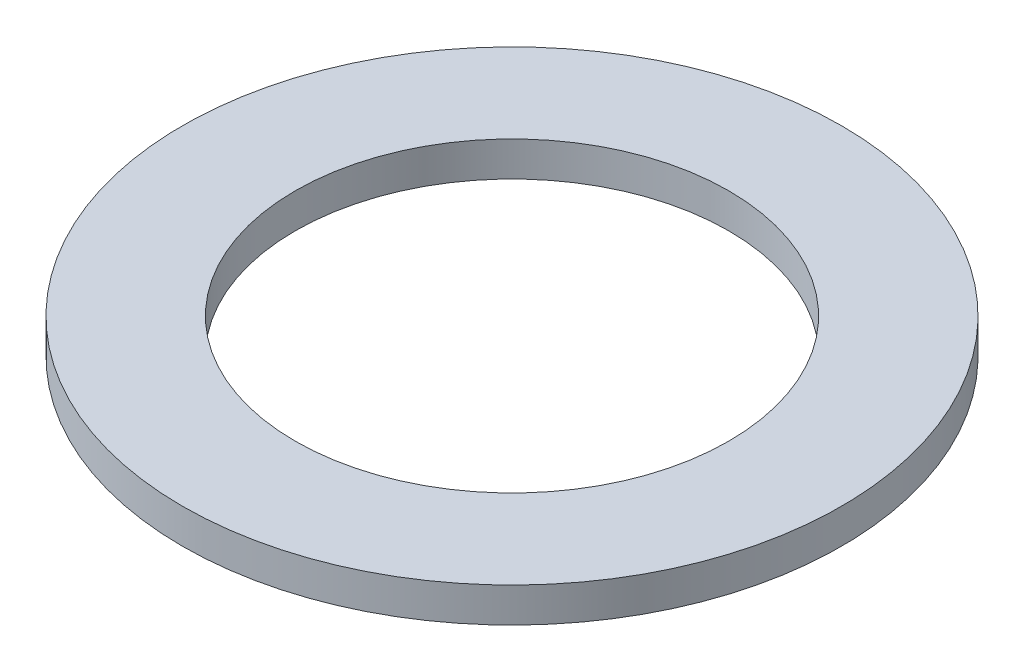
ISO-10303-21;
HEADER;
FILE_DESCRIPTION(('STEP AP214'),'2;1');
FILE_NAME('part.step','',(''),(''),'','','');
FILE_SCHEMA(('AUTOMOTIVE_DESIGN { 1 0 10303 214 1 1 1 1 }'));
ENDSEC;
DATA;
#1=APPLICATION_CONTEXT('core data for automotive mechanical design processes');
#2=APPLICATION_PROTOCOL_DEFINITION('international standard','automotive_design',2000,#1);
#3=PRODUCT_CONTEXT('',#1,'mechanical');
#4=PRODUCT('Part','Part','',(#3));
#5=PRODUCT_RELATED_PRODUCT_CATEGORY('part','',(#4));
#6=PRODUCT_DEFINITION_FORMATION('','',#4);
#7=PRODUCT_DEFINITION_CONTEXT('part definition',#1,'design');
#8=PRODUCT_DEFINITION('design','',#6,#7);
#9=PRODUCT_DEFINITION_SHAPE('','',#8);
#10=(LENGTH_UNIT() NAMED_UNIT(*) SI_UNIT(.MILLI.,.METRE.));
#11=(NAMED_UNIT(*) PLANE_ANGLE_UNIT() SI_UNIT($,.RADIAN.));
#12=(NAMED_UNIT(*) SI_UNIT($,.STERADIAN.) SOLID_ANGLE_UNIT());
#13=UNCERTAINTY_MEASURE_WITH_UNIT(LENGTH_MEASURE(1.E-05),#10,'distance_accuracy_value','');
#14=(GEOMETRIC_REPRESENTATION_CONTEXT(3) GLOBAL_UNCERTAINTY_ASSIGNED_CONTEXT((#13)) GLOBAL_UNIT_ASSIGNED_CONTEXT((#10,
#11,#12)) REPRESENTATION_CONTEXT('',''));
#15=CARTESIAN_POINT('',(0.,0.,0.));
#16=DIRECTION('',(0.,0.,1.));
#17=DIRECTION('',(1.,0.,0.));
#18=AXIS2_PLACEMENT_3D('',#15,#16,#17);
#19=CARTESIAN_POINT('',(0.,2.,0.));
#20=DIRECTION('',(0.,1.,0.));
#21=DIRECTION('',(0.,0.,-1.));
#22=AXIS2_PLACEMENT_3D('',#19,#20,#21);
#23=PLANE('',#22);
#24=CARTESIAN_POINT('',(0.,2.,0.));
#25=DIRECTION('',(0.,-1.,0.));
#26=DIRECTION('',(0.,0.,-1.));
#27=AXIS2_PLACEMENT_3D('',#24,#25,#26);
#28=CIRCLE('',#27,19.);
#29=CARTESIAN_POINT('',(0.,2.,-19.));
#30=VERTEX_POINT('',#29);
#31=EDGE_CURVE('E10',#30,#30,#28,.T.);
#32=ORIENTED_EDGE('',*,*,#31,.F.);
#33=EDGE_LOOP('',(#32));
#34=FACE_BOUND('',#33,.T.);
#35=CARTESIAN_POINT('',(0.,2.,0.));
#36=DIRECTION('',(0.,-1.,0.));
#37=DIRECTION('',(0.,0.,-1.));
#38=AXIS2_PLACEMENT_3D('',#35,#36,#37);
#39=CIRCLE('',#38,12.5);
#40=CARTESIAN_POINT('',(0.,2.,-12.5));
#41=VERTEX_POINT('',#40);
#42=EDGE_CURVE('E46',#41,#41,#39,.T.);
#43=ORIENTED_EDGE('',*,*,#42,.T.);
#44=EDGE_LOOP('',(#43));
#45=FACE_BOUND('',#44,.T.);
#46=ADVANCED_FACE('F35',(#34,#45),#23,.T.);
#47=CARTESIAN_POINT('',(0.,0.,0.));
#48=DIRECTION('',(0.,1.,0.));
#49=DIRECTION('',(0.,0.,-1.));
#50=AXIS2_PLACEMENT_3D('',#47,#48,#49);
#51=PLANE('',#50);
#52=CARTESIAN_POINT('',(0.,0.,0.));
#53=DIRECTION('',(0.,-1.,0.));
#54=DIRECTION('',(0.,0.,-1.));
#55=AXIS2_PLACEMENT_3D('',#52,#53,#54);
#56=CIRCLE('',#55,19.);
#57=CARTESIAN_POINT('',(0.,0.,-19.));
#58=VERTEX_POINT('',#57);
#59=EDGE_CURVE('E39',#58,#58,#56,.T.);
#60=ORIENTED_EDGE('',*,*,#59,.T.);
#61=EDGE_LOOP('',(#60));
#62=FACE_BOUND('',#61,.T.);
#63=CARTESIAN_POINT('',(0.,0.,0.));
#64=DIRECTION('',(0.,-1.,0.));
#65=DIRECTION('',(0.,0.,-1.));
#66=AXIS2_PLACEMENT_3D('',#63,#64,#65);
#67=CIRCLE('',#66,12.5);
#68=CARTESIAN_POINT('',(0.,0.,-12.5));
#69=VERTEX_POINT('',#68);
#70=EDGE_CURVE('E48',#69,#69,#67,.T.);
#71=ORIENTED_EDGE('',*,*,#70,.F.);
#72=EDGE_LOOP('',(#71));
#73=FACE_BOUND('',#72,.T.);
#74=ADVANCED_FACE('F61',(#62,#73),#51,.F.);
#75=CARTESIAN_POINT('',(0.,2.,0.));
#76=DIRECTION('',(0.,-1.,0.));
#77=DIRECTION('',(0.,0.,1.));
#78=AXIS2_PLACEMENT_3D('',#75,#76,#77);
#79=CYLINDRICAL_SURFACE('',#78,19.);
#80=ORIENTED_EDGE('',*,*,#31,.T.);
#81=EDGE_LOOP('',(#80));
#82=FACE_BOUND('',#81,.T.);
#83=ORIENTED_EDGE('',*,*,#59,.F.);
#84=EDGE_LOOP('',(#83));
#85=FACE_BOUND('',#84,.T.);
#86=ADVANCED_FACE('F37',(#82,#85),#79,.T.);
#87=CARTESIAN_POINT('',(0.,2.,0.));
#88=DIRECTION('',(0.,-1.,0.));
#89=DIRECTION('',(0.,0.,1.));
#90=AXIS2_PLACEMENT_3D('',#87,#88,#89);
#91=CYLINDRICAL_SURFACE('',#90,12.5);
#92=ORIENTED_EDGE('',*,*,#42,.F.);
#93=EDGE_LOOP('',(#92));
#94=FACE_BOUND('',#93,.T.);
#95=ORIENTED_EDGE('',*,*,#70,.T.);
#96=EDGE_LOOP('',(#95));
#97=FACE_BOUND('',#96,.T.);
#98=ADVANCED_FACE('F55',(#94,#97),#91,.F.);
#99=CLOSED_SHELL('',(#46,#74,#86,#98));
#100=MANIFOLD_SOLID_BREP('B2',#99);
#101=ADVANCED_BREP_SHAPE_REPRESENTATION('',(#18,#100),#14);
#102=SHAPE_DEFINITION_REPRESENTATION(#9,#101);
ENDSEC;
END-ISO-10303-21;
